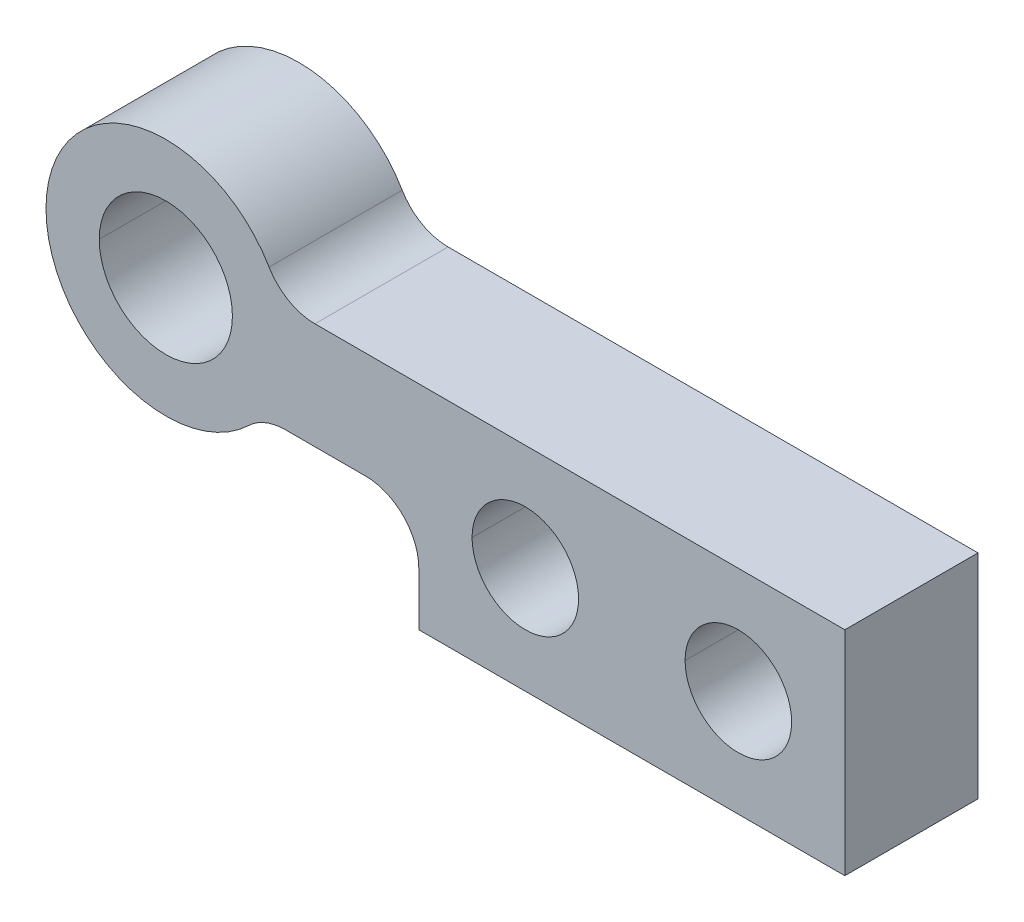
ISO-10303-21;
HEADER;
FILE_DESCRIPTION(('STEP AP214'),'2;1');
FILE_NAME('part.step','',(''),(''),'','','');
FILE_SCHEMA(('AUTOMOTIVE_DESIGN { 1 0 10303 214 1 1 1 1 }'));
ENDSEC;
DATA;
#1=APPLICATION_CONTEXT('core data for automotive mechanical design processes');
#2=APPLICATION_PROTOCOL_DEFINITION('international standard','automotive_design',2000,#1);
#3=PRODUCT_CONTEXT('',#1,'mechanical');
#4=PRODUCT('Part','Part','',(#3));
#5=PRODUCT_RELATED_PRODUCT_CATEGORY('part','',(#4));
#6=PRODUCT_DEFINITION_FORMATION('','',#4);
#7=PRODUCT_DEFINITION_CONTEXT('part definition',#1,'design');
#8=PRODUCT_DEFINITION('design','',#6,#7);
#9=PRODUCT_DEFINITION_SHAPE('','',#8);
#10=(LENGTH_UNIT() NAMED_UNIT(*) SI_UNIT(.MILLI.,.METRE.));
#11=(NAMED_UNIT(*) PLANE_ANGLE_UNIT() SI_UNIT($,.RADIAN.));
#12=(NAMED_UNIT(*) SI_UNIT($,.STERADIAN.) SOLID_ANGLE_UNIT());
#13=UNCERTAINTY_MEASURE_WITH_UNIT(LENGTH_MEASURE(1.E-05),#10,'distance_accuracy_value','');
#14=(GEOMETRIC_REPRESENTATION_CONTEXT(3) GLOBAL_UNCERTAINTY_ASSIGNED_CONTEXT((#13)) GLOBAL_UNIT_ASSIGNED_CONTEXT((#10,
#11,#12)) REPRESENTATION_CONTEXT('',''));
#15=CARTESIAN_POINT('',(0.,0.,0.));
#16=DIRECTION('',(0.,0.,1.));
#17=DIRECTION('',(1.,0.,0.));
#18=AXIS2_PLACEMENT_3D('',#15,#16,#17);
#19=CARTESIAN_POINT('',(-10.,-2.,5.));
#20=DIRECTION('',(0.,0.,-1.));
#21=DIRECTION('',(-1.,0.,0.));
#22=AXIS2_PLACEMENT_3D('',#19,#20,#21);
#23=CYLINDRICAL_SURFACE('',#22,2.);
#24=CARTESIAN_POINT('',(-10.,-2.,5.));
#25=DIRECTION('',(0.,0.,-1.));
#26=DIRECTION('',(1.,0.,0.));
#27=AXIS2_PLACEMENT_3D('',#24,#25,#26);
#28=CIRCLE('',#27,2.);
#29=CARTESIAN_POINT('',(-10.,0.,5.));
#30=VERTEX_POINT('',#29);
#31=CARTESIAN_POINT('',(-8.,-2.,5.));
#32=VERTEX_POINT('',#31);
#33=EDGE_CURVE('E281',#30,#32,#28,.T.);
#34=ORIENTED_EDGE('',*,*,#33,.F.);
#35=DIRECTION('',(0.,0.,1.));
#36=VECTOR('',#35,1.);
#37=CARTESIAN_POINT('',(-10.,0.,5.));
#38=LINE('',#37,#36);
#39=CARTESIAN_POINT('',(-10.,0.,0.));
#40=VERTEX_POINT('',#39);
#41=EDGE_CURVE('E241',#40,#30,#38,.T.);
#42=ORIENTED_EDGE('',*,*,#41,.F.);
#43=CARTESIAN_POINT('',(-10.,-2.,0.));
#44=DIRECTION('',(0.,0.,1.));
#45=DIRECTION('',(1.,0.,0.));
#46=AXIS2_PLACEMENT_3D('',#43,#44,#45);
#47=CIRCLE('',#46,2.);
#48=CARTESIAN_POINT('',(-8.,-2.,0.));
#49=VERTEX_POINT('',#48);
#50=EDGE_CURVE('E27',#49,#40,#47,.T.);
#51=ORIENTED_EDGE('',*,*,#50,.F.);
#52=DIRECTION('',(0.,0.,-1.));
#53=VECTOR('',#52,1.);
#54=CARTESIAN_POINT('',(-8.,-2.,5.));
#55=LINE('',#54,#53);
#56=EDGE_CURVE('E189',#32,#49,#55,.T.);
#57=ORIENTED_EDGE('',*,*,#56,.F.);
#58=EDGE_LOOP('',(#34,#42,#51,#57));
#59=FACE_BOUND('',#58,.T.);
#60=ADVANCED_FACE('F16',(#59),#23,.F.);
#61=CARTESIAN_POINT('',(-13.0100111358713,-2.,5.));
#62=DIRECTION('',(0.,0.,-1.));
#63=DIRECTION('',(-1.,0.,0.));
#64=AXIS2_PLACEMENT_3D('',#61,#62,#63);
#65=CYLINDRICAL_SURFACE('',#64,2.);
#66=CARTESIAN_POINT('',(-13.0100111358713,-2.,5.));
#67=DIRECTION('',(0.,0.,-1.));
#68=DIRECTION('',(1.,0.,0.));
#69=AXIS2_PLACEMENT_3D('',#66,#67,#68);
#70=CIRCLE('',#69,2.);
#71=CARTESIAN_POINT('',(-14.3915461709878,-0.553846153846153,5.));
#72=VERTEX_POINT('',#71);
#73=CARTESIAN_POINT('',(-13.0100111358713,0.,5.));
#74=VERTEX_POINT('',#73);
#75=EDGE_CURVE('E197',#72,#74,#70,.T.);
#76=ORIENTED_EDGE('',*,*,#75,.F.);
#77=DIRECTION('',(0.,0.,1.));
#78=VECTOR('',#77,1.);
#79=CARTESIAN_POINT('',(-14.3915461709878,-0.553846153846153,5.));
#80=LINE('',#79,#78);
#81=CARTESIAN_POINT('',(-14.3915461709878,-0.553846153846153,0.));
#82=VERTEX_POINT('',#81);
#83=EDGE_CURVE('E157',#82,#72,#80,.T.);
#84=ORIENTED_EDGE('',*,*,#83,.F.);
#85=CARTESIAN_POINT('',(-13.0100111358713,-2.,0.));
#86=DIRECTION('',(0.,0.,1.));
#87=DIRECTION('',(1.,0.,0.));
#88=AXIS2_PLACEMENT_3D('',#85,#86,#87);
#89=CIRCLE('',#88,2.);
#90=CARTESIAN_POINT('',(-13.0100111358713,0.,0.));
#91=VERTEX_POINT('',#90);
#92=EDGE_CURVE('E11',#91,#82,#89,.T.);
#93=ORIENTED_EDGE('',*,*,#92,.F.);
#94=DIRECTION('',(0.,0.,-1.));
#95=VECTOR('',#94,1.);
#96=CARTESIAN_POINT('',(-13.0100111358713,0.,5.));
#97=LINE('',#96,#95);
#98=EDGE_CURVE('E233',#74,#91,#97,.T.);
#99=ORIENTED_EDGE('',*,*,#98,.F.);
#100=EDGE_LOOP('',(#76,#84,#93,#99));
#101=FACE_BOUND('',#100,.T.);
#102=ADVANCED_FACE('F347',(#101),#65,.F.);
#103=CARTESIAN_POINT('',(-11.9,6.,5.));
#104=DIRECTION('',(0.,0.,-1.));
#105=DIRECTION('',(-1.,0.,0.));
#106=AXIS2_PLACEMENT_3D('',#103,#104,#105);
#107=CYLINDRICAL_SURFACE('',#106,2.);
#108=CARTESIAN_POINT('',(-11.9,6.,5.));
#109=DIRECTION('',(0.,0.,-1.));
#110=DIRECTION('',(1.,0.,0.));
#111=AXIS2_PLACEMENT_3D('',#108,#109,#110);
#112=CIRCLE('',#111,2.);
#113=CARTESIAN_POINT('',(-11.9,4.,5.));
#114=VERTEX_POINT('',#113);
#115=CARTESIAN_POINT('',(-13.6230769230769,4.98461538461538,5.));
#116=VERTEX_POINT('',#115);
#117=EDGE_CURVE('E194',#114,#116,#112,.T.);
#118=ORIENTED_EDGE('',*,*,#117,.F.);
#119=DIRECTION('',(0.,0.,1.));
#120=VECTOR('',#119,1.);
#121=CARTESIAN_POINT('',(-11.9,4.,5.));
#122=LINE('',#121,#120);
#123=CARTESIAN_POINT('',(-11.9,4.,0.));
#124=VERTEX_POINT('',#123);
#125=EDGE_CURVE('E210',#124,#114,#122,.T.);
#126=ORIENTED_EDGE('',*,*,#125,.F.);
#127=CARTESIAN_POINT('',(-11.9,6.,0.));
#128=DIRECTION('',(0.,0.,1.));
#129=DIRECTION('',(1.,0.,0.));
#130=AXIS2_PLACEMENT_3D('',#127,#128,#129);
#131=CIRCLE('',#130,2.);
#132=CARTESIAN_POINT('',(-13.6230769230769,4.98461538461538,0.));
#133=VERTEX_POINT('',#132);
#134=EDGE_CURVE('E267',#133,#124,#131,.T.);
#135=ORIENTED_EDGE('',*,*,#134,.F.);
#136=DIRECTION('',(0.,0.,-1.));
#137=VECTOR('',#136,1.);
#138=CARTESIAN_POINT('',(-13.6230769230769,4.98461538461538,5.));
#139=LINE('',#138,#137);
#140=EDGE_CURVE('E145',#116,#133,#139,.T.);
#141=ORIENTED_EDGE('',*,*,#140,.F.);
#142=EDGE_LOOP('',(#118,#126,#135,#141));
#143=FACE_BOUND('',#142,.T.);
#144=ADVANCED_FACE('F353',(#143),#107,.F.);
#145=CARTESIAN_POINT('',(0.,0.,0.));
#146=DIRECTION('',(0.,0.,1.));
#147=DIRECTION('',(1.,0.,0.));
#148=AXIS2_PLACEMENT_3D('',#145,#146,#147);
#149=PLANE('',#148);
#150=CARTESIAN_POINT('',(-17.5,2.7,0.));
#151=DIRECTION('',(0.,0.,1.));
#152=DIRECTION('',(1.,0.,0.));
#153=AXIS2_PLACEMENT_3D('',#150,#151,#152);
#154=CIRCLE('',#153,2.5);
#155=CARTESIAN_POINT('',(-20.,2.7,0.));
#156=VERTEX_POINT('',#155);
#157=CARTESIAN_POINT('',(-15.,2.7,0.));
#158=VERTEX_POINT('',#157);
#159=EDGE_CURVE('E250',#156,#158,#154,.T.);
#160=ORIENTED_EDGE('',*,*,#159,.T.);
#161=CARTESIAN_POINT('',(-17.5,2.7,0.));
#162=DIRECTION('',(0.,0.,1.));
#163=DIRECTION('',(1.,0.,0.));
#164=AXIS2_PLACEMENT_3D('',#161,#162,#163);
#165=CIRCLE('',#164,2.5);
#166=EDGE_CURVE('E20',#158,#156,#165,.T.);
#167=ORIENTED_EDGE('',*,*,#166,.T.);
#168=EDGE_LOOP('',(#160,#167));
#169=FACE_BOUND('',#168,.T.);
#170=CARTESIAN_POINT('',(-4.,0.,0.));
#171=DIRECTION('',(0.,0.,1.));
#172=DIRECTION('',(1.,0.,0.));
#173=AXIS2_PLACEMENT_3D('',#170,#171,#172);
#174=CIRCLE('',#173,2.);
#175=CARTESIAN_POINT('',(-6.,0.,0.));
#176=VERTEX_POINT('',#175);
#177=CARTESIAN_POINT('',(-2.,0.,0.));
#178=VERTEX_POINT('',#177);
#179=EDGE_CURVE('E190',#176,#178,#174,.T.);
#180=ORIENTED_EDGE('',*,*,#179,.T.);
#181=CARTESIAN_POINT('',(-4.,0.,0.));
#182=DIRECTION('',(0.,0.,1.));
#183=DIRECTION('',(1.,0.,0.));
#184=AXIS2_PLACEMENT_3D('',#181,#182,#183);
#185=CIRCLE('',#184,2.);
#186=EDGE_CURVE('E228',#178,#176,#185,.T.);
#187=ORIENTED_EDGE('',*,*,#186,.T.);
#188=EDGE_LOOP('',(#180,#187));
#189=FACE_BOUND('',#188,.T.);
#190=CARTESIAN_POINT('',(4.,0.,0.));
#191=DIRECTION('',(0.,0.,1.));
#192=DIRECTION('',(1.,0.,0.));
#193=AXIS2_PLACEMENT_3D('',#190,#191,#192);
#194=CIRCLE('',#193,2.);
#195=CARTESIAN_POINT('',(2.,0.,0.));
#196=VERTEX_POINT('',#195);
#197=CARTESIAN_POINT('',(6.,0.,0.));
#198=VERTEX_POINT('',#197);
#199=EDGE_CURVE('E171',#196,#198,#194,.T.);
#200=ORIENTED_EDGE('',*,*,#199,.T.);
#201=CARTESIAN_POINT('',(4.,0.,0.));
#202=DIRECTION('',(0.,0.,1.));
#203=DIRECTION('',(1.,0.,0.));
#204=AXIS2_PLACEMENT_3D('',#201,#202,#203);
#205=CIRCLE('',#204,2.);
#206=EDGE_CURVE('E242',#198,#196,#205,.T.);
#207=ORIENTED_EDGE('',*,*,#206,.T.);
#208=EDGE_LOOP('',(#200,#207));
#209=FACE_BOUND('',#208,.T.);
#210=CARTESIAN_POINT('',(-17.5,2.7,0.));
#211=DIRECTION('',(0.,0.,1.));
#212=DIRECTION('',(1.,0.,0.));
#213=AXIS2_PLACEMENT_3D('',#210,#211,#212);
#214=CIRCLE('',#213,4.5);
#215=CARTESIAN_POINT('',(-22.,2.7,0.));
#216=VERTEX_POINT('',#215);
#217=EDGE_CURVE('E138',#133,#216,#214,.T.);
#218=ORIENTED_EDGE('',*,*,#217,.F.);
#219=ORIENTED_EDGE('',*,*,#134,.T.);
#220=DIRECTION('',(1.,0.,0.));
#221=VECTOR('',#220,1.);
#222=CARTESIAN_POINT('',(0.,4.,0.));
#223=LINE('',#222,#221);
#224=CARTESIAN_POINT('',(8.,4.,0.));
#225=VERTEX_POINT('',#224);
#226=EDGE_CURVE('E206',#124,#225,#223,.T.);
#227=ORIENTED_EDGE('',*,*,#226,.T.);
#228=DIRECTION('',(0.,-1.,0.));
#229=VECTOR('',#228,1.);
#230=CARTESIAN_POINT('',(8.,0.,0.));
#231=LINE('',#230,#229);
#232=CARTESIAN_POINT('',(8.,-4.,0.));
#233=VERTEX_POINT('',#232);
#234=EDGE_CURVE('E201',#225,#233,#231,.T.);
#235=ORIENTED_EDGE('',*,*,#234,.T.);
#236=DIRECTION('',(1.,0.,0.));
#237=VECTOR('',#236,1.);
#238=CARTESIAN_POINT('',(0.,-4.,0.));
#239=LINE('',#238,#237);
#240=CARTESIAN_POINT('',(-8.,-4.,0.));
#241=VERTEX_POINT('',#240);
#242=EDGE_CURVE('E221',#241,#233,#239,.T.);
#243=ORIENTED_EDGE('',*,*,#242,.F.);
#244=DIRECTION('',(0.,-1.,0.));
#245=VECTOR('',#244,1.);
#246=CARTESIAN_POINT('',(-8.,0.,0.));
#247=LINE('',#246,#245);
#248=EDGE_CURVE('E184',#49,#241,#247,.T.);
#249=ORIENTED_EDGE('',*,*,#248,.F.);
#250=ORIENTED_EDGE('',*,*,#50,.T.);
#251=DIRECTION('',(-1.,0.,0.));
#252=VECTOR('',#251,1.);
#253=CARTESIAN_POINT('',(0.,0.,0.));
#254=LINE('',#253,#252);
#255=EDGE_CURVE('E261',#40,#91,#254,.T.);
#256=ORIENTED_EDGE('',*,*,#255,.T.);
#257=ORIENTED_EDGE('',*,*,#92,.T.);
#258=CARTESIAN_POINT('',(-17.5,2.7,0.));
#259=DIRECTION('',(0.,0.,1.));
#260=DIRECTION('',(1.,0.,0.));
#261=AXIS2_PLACEMENT_3D('',#258,#259,#260);
#262=CIRCLE('',#261,4.5);
#263=EDGE_CURVE('E150',#216,#82,#262,.T.);
#264=ORIENTED_EDGE('',*,*,#263,.F.);
#265=EDGE_LOOP('',(#218,#219,#227,#235,#243,#249,#250,#256,#257,#264));
#266=FACE_BOUND('',#265,.T.);
#267=ADVANCED_FACE('F151',(#169,#189,#209,#266),#149,.F.);
#268=CARTESIAN_POINT('',(0.,0.,5.));
#269=DIRECTION('',(0.,0.,1.));
#270=DIRECTION('',(1.,0.,0.));
#271=AXIS2_PLACEMENT_3D('',#268,#269,#270);
#272=PLANE('',#271);
#273=CARTESIAN_POINT('',(-17.5,2.7,5.));
#274=DIRECTION('',(0.,0.,1.));
#275=DIRECTION('',(1.,0.,0.));
#276=AXIS2_PLACEMENT_3D('',#273,#274,#275);
#277=CIRCLE('',#276,2.5);
#278=CARTESIAN_POINT('',(-20.,2.7,5.));
#279=VERTEX_POINT('',#278);
#280=CARTESIAN_POINT('',(-15.,2.7,5.));
#281=VERTEX_POINT('',#280);
#282=EDGE_CURVE('E268',#279,#281,#277,.T.);
#283=ORIENTED_EDGE('',*,*,#282,.F.);
#284=CARTESIAN_POINT('',(-17.5,2.7,5.));
#285=DIRECTION('',(0.,0.,1.));
#286=DIRECTION('',(1.,0.,0.));
#287=AXIS2_PLACEMENT_3D('',#284,#285,#286);
#288=CIRCLE('',#287,2.5);
#289=EDGE_CURVE('E200',#281,#279,#288,.T.);
#290=ORIENTED_EDGE('',*,*,#289,.F.);
#291=EDGE_LOOP('',(#283,#290));
#292=FACE_BOUND('',#291,.T.);
#293=CARTESIAN_POINT('',(-4.,0.,5.));
#294=DIRECTION('',(0.,0.,1.));
#295=DIRECTION('',(1.,0.,0.));
#296=AXIS2_PLACEMENT_3D('',#293,#294,#295);
#297=CIRCLE('',#296,2.);
#298=CARTESIAN_POINT('',(-6.,0.,5.));
#299=VERTEX_POINT('',#298);
#300=CARTESIAN_POINT('',(-2.,0.,5.));
#301=VERTEX_POINT('',#300);
#302=EDGE_CURVE('E179',#299,#301,#297,.T.);
#303=ORIENTED_EDGE('',*,*,#302,.F.);
#304=CARTESIAN_POINT('',(-4.,0.,5.));
#305=DIRECTION('',(0.,0.,1.));
#306=DIRECTION('',(1.,0.,0.));
#307=AXIS2_PLACEMENT_3D('',#304,#305,#306);
#308=CIRCLE('',#307,2.);
#309=EDGE_CURVE('E224',#301,#299,#308,.T.);
#310=ORIENTED_EDGE('',*,*,#309,.F.);
#311=EDGE_LOOP('',(#303,#310));
#312=FACE_BOUND('',#311,.T.);
#313=CARTESIAN_POINT('',(4.,0.,5.));
#314=DIRECTION('',(0.,0.,1.));
#315=DIRECTION('',(1.,0.,0.));
#316=AXIS2_PLACEMENT_3D('',#313,#314,#315);
#317=CIRCLE('',#316,2.);
#318=CARTESIAN_POINT('',(2.,0.,5.));
#319=VERTEX_POINT('',#318);
#320=CARTESIAN_POINT('',(6.,0.,5.));
#321=VERTEX_POINT('',#320);
#322=EDGE_CURVE('E205',#319,#321,#317,.T.);
#323=ORIENTED_EDGE('',*,*,#322,.F.);
#324=CARTESIAN_POINT('',(4.,0.,5.));
#325=DIRECTION('',(0.,0.,1.));
#326=DIRECTION('',(1.,0.,0.));
#327=AXIS2_PLACEMENT_3D('',#324,#325,#326);
#328=CIRCLE('',#327,2.);
#329=EDGE_CURVE('E246',#321,#319,#328,.T.);
#330=ORIENTED_EDGE('',*,*,#329,.F.);
#331=EDGE_LOOP('',(#323,#330));
#332=FACE_BOUND('',#331,.T.);
#333=DIRECTION('',(1.,0.,0.));
#334=VECTOR('',#333,1.);
#335=CARTESIAN_POINT('',(0.,4.,5.));
#336=LINE('',#335,#334);
#337=CARTESIAN_POINT('',(8.,4.,5.));
#338=VERTEX_POINT('',#337);
#339=EDGE_CURVE('E254',#114,#338,#336,.T.);
#340=ORIENTED_EDGE('',*,*,#339,.F.);
#341=ORIENTED_EDGE('',*,*,#117,.T.);
#342=CARTESIAN_POINT('',(-17.5,2.7,5.));
#343=DIRECTION('',(0.,0.,1.));
#344=DIRECTION('',(1.,0.,0.));
#345=AXIS2_PLACEMENT_3D('',#342,#343,#344);
#346=CIRCLE('',#345,4.5);
#347=CARTESIAN_POINT('',(-22.,2.7,5.));
#348=VERTEX_POINT('',#347);
#349=EDGE_CURVE('E257',#116,#348,#346,.T.);
#350=ORIENTED_EDGE('',*,*,#349,.T.);
#351=CARTESIAN_POINT('',(-17.5,2.7,5.));
#352=DIRECTION('',(0.,0.,1.));
#353=DIRECTION('',(1.,0.,0.));
#354=AXIS2_PLACEMENT_3D('',#351,#352,#353);
#355=CIRCLE('',#354,4.5);
#356=EDGE_CURVE('E161',#348,#72,#355,.T.);
#357=ORIENTED_EDGE('',*,*,#356,.T.);
#358=ORIENTED_EDGE('',*,*,#75,.T.);
#359=DIRECTION('',(-1.,0.,0.));
#360=VECTOR('',#359,1.);
#361=CARTESIAN_POINT('',(0.,0.,5.));
#362=LINE('',#361,#360);
#363=EDGE_CURVE('E148',#30,#74,#362,.T.);
#364=ORIENTED_EDGE('',*,*,#363,.F.);
#365=ORIENTED_EDGE('',*,*,#33,.T.);
#366=DIRECTION('',(0.,-1.,0.));
#367=VECTOR('',#366,1.);
#368=CARTESIAN_POINT('',(-8.,0.,5.));
#369=LINE('',#368,#367);
#370=CARTESIAN_POINT('',(-8.,-4.,5.));
#371=VERTEX_POINT('',#370);
#372=EDGE_CURVE('E237',#32,#371,#369,.T.);
#373=ORIENTED_EDGE('',*,*,#372,.T.);
#374=DIRECTION('',(1.,0.,0.));
#375=VECTOR('',#374,1.);
#376=CARTESIAN_POINT('',(0.,-4.,5.));
#377=LINE('',#376,#375);
#378=CARTESIAN_POINT('',(8.,-4.,5.));
#379=VERTEX_POINT('',#378);
#380=EDGE_CURVE('E229',#371,#379,#377,.T.);
#381=ORIENTED_EDGE('',*,*,#380,.T.);
#382=DIRECTION('',(0.,-1.,0.));
#383=VECTOR('',#382,1.);
#384=CARTESIAN_POINT('',(8.,0.,5.));
#385=LINE('',#384,#383);
#386=EDGE_CURVE('E42',#338,#379,#385,.T.);
#387=ORIENTED_EDGE('',*,*,#386,.F.);
#388=EDGE_LOOP('',(#340,#341,#350,#357,#358,#364,#365,#373,#381,#387));
#389=FACE_BOUND('',#388,.T.);
#390=ADVANCED_FACE('F341',(#292,#312,#332,#389),#272,.T.);
#391=CARTESIAN_POINT('',(-17.5,2.7,5.));
#392=DIRECTION('',(0.,0.,-1.));
#393=DIRECTION('',(-1.,0.,0.));
#394=AXIS2_PLACEMENT_3D('',#391,#392,#393);
#395=CYLINDRICAL_SURFACE('',#394,2.5);
#396=DIRECTION('',(0.,0.,-1.));
#397=VECTOR('',#396,1.);
#398=CARTESIAN_POINT('',(-15.,2.7,5.));
#399=LINE('',#398,#397);
#400=EDGE_CURVE('E271',#281,#158,#399,.T.);
#401=ORIENTED_EDGE('',*,*,#400,.F.);
#402=ORIENTED_EDGE('',*,*,#289,.T.);
#403=DIRECTION('',(0.,0.,-1.));
#404=VECTOR('',#403,1.);
#405=CARTESIAN_POINT('',(-20.,2.7,5.));
#406=LINE('',#405,#404);
#407=EDGE_CURVE('E217',#279,#156,#406,.T.);
#408=ORIENTED_EDGE('',*,*,#407,.T.);
#409=ORIENTED_EDGE('',*,*,#166,.F.);
#410=EDGE_LOOP('',(#401,#402,#408,#409));
#411=FACE_BOUND('',#410,.T.);
#412=ADVANCED_FACE('F331',(#411),#395,.F.);
#413=CARTESIAN_POINT('',(8.,0.,5.));
#414=DIRECTION('',(1.,0.,0.));
#415=DIRECTION('',(0.,1.,0.));
#416=AXIS2_PLACEMENT_3D('',#413,#414,#415);
#417=PLANE('',#416);
#418=ORIENTED_EDGE('',*,*,#234,.F.);
#419=DIRECTION('',(0.,0.,-1.));
#420=VECTOR('',#419,1.);
#421=CARTESIAN_POINT('',(8.,4.,5.));
#422=LINE('',#421,#420);
#423=EDGE_CURVE('E284',#338,#225,#422,.T.);
#424=ORIENTED_EDGE('',*,*,#423,.F.);
#425=ORIENTED_EDGE('',*,*,#386,.T.);
#426=DIRECTION('',(0.,0.,-1.));
#427=VECTOR('',#426,1.);
#428=CARTESIAN_POINT('',(8.,-4.,5.));
#429=LINE('',#428,#427);
#430=EDGE_CURVE('E236',#379,#233,#429,.T.);
#431=ORIENTED_EDGE('',*,*,#430,.T.);
#432=EDGE_LOOP('',(#418,#424,#425,#431));
#433=FACE_BOUND('',#432,.T.);
#434=ADVANCED_FACE('F328',(#433),#417,.T.);
#435=CARTESIAN_POINT('',(4.,0.,5.));
#436=DIRECTION('',(0.,0.,-1.));
#437=DIRECTION('',(-1.,0.,0.));
#438=AXIS2_PLACEMENT_3D('',#435,#436,#437);
#439=CYLINDRICAL_SURFACE('',#438,2.);
#440=DIRECTION('',(0.,0.,-1.));
#441=VECTOR('',#440,1.);
#442=CARTESIAN_POINT('',(6.,0.,5.));
#443=LINE('',#442,#441);
#444=EDGE_CURVE('E175',#321,#198,#443,.T.);
#445=ORIENTED_EDGE('',*,*,#444,.F.);
#446=ORIENTED_EDGE('',*,*,#329,.T.);
#447=DIRECTION('',(0.,0.,-1.));
#448=VECTOR('',#447,1.);
#449=CARTESIAN_POINT('',(2.,0.,5.));
#450=LINE('',#449,#448);
#451=EDGE_CURVE('E174',#319,#196,#450,.T.);
#452=ORIENTED_EDGE('',*,*,#451,.T.);
#453=ORIENTED_EDGE('',*,*,#206,.F.);
#454=EDGE_LOOP('',(#445,#446,#452,#453));
#455=FACE_BOUND('',#454,.T.);
#456=ADVANCED_FACE('F330',(#455),#439,.F.);
#457=CARTESIAN_POINT('',(-4.,0.,5.));
#458=DIRECTION('',(0.,0.,-1.));
#459=DIRECTION('',(-1.,0.,0.));
#460=AXIS2_PLACEMENT_3D('',#457,#458,#459);
#461=CYLINDRICAL_SURFACE('',#460,2.);
#462=DIRECTION('',(0.,0.,-1.));
#463=VECTOR('',#462,1.);
#464=CARTESIAN_POINT('',(-2.,0.,5.));
#465=LINE('',#464,#463);
#466=EDGE_CURVE('E183',#301,#178,#465,.T.);
#467=ORIENTED_EDGE('',*,*,#466,.F.);
#468=ORIENTED_EDGE('',*,*,#309,.T.);
#469=DIRECTION('',(0.,0.,-1.));
#470=VECTOR('',#469,1.);
#471=CARTESIAN_POINT('',(-6.,0.,5.));
#472=LINE('',#471,#470);
#473=EDGE_CURVE('E168',#299,#176,#472,.T.);
#474=ORIENTED_EDGE('',*,*,#473,.T.);
#475=ORIENTED_EDGE('',*,*,#186,.F.);
#476=EDGE_LOOP('',(#467,#468,#474,#475));
#477=FACE_BOUND('',#476,.T.);
#478=ADVANCED_FACE('F338',(#477),#461,.F.);
#479=CARTESIAN_POINT('',(0.,-4.,5.));
#480=DIRECTION('',(0.,1.,0.));
#481=DIRECTION('',(1.,0.,0.));
#482=AXIS2_PLACEMENT_3D('',#479,#480,#481);
#483=PLANE('',#482);
#484=ORIENTED_EDGE('',*,*,#242,.T.);
#485=ORIENTED_EDGE('',*,*,#430,.F.);
#486=ORIENTED_EDGE('',*,*,#380,.F.);
#487=DIRECTION('',(0.,0.,-1.));
#488=VECTOR('',#487,1.);
#489=CARTESIAN_POINT('',(-8.,-4.,5.));
#490=LINE('',#489,#488);
#491=EDGE_CURVE('E188',#371,#241,#490,.T.);
#492=ORIENTED_EDGE('',*,*,#491,.T.);
#493=EDGE_LOOP('',(#484,#485,#486,#492));
#494=FACE_BOUND('',#493,.T.);
#495=ADVANCED_FACE('F322',(#494),#483,.F.);
#496=CARTESIAN_POINT('',(-8.,0.,5.));
#497=DIRECTION('',(1.,0.,0.));
#498=DIRECTION('',(0.,1.,0.));
#499=AXIS2_PLACEMENT_3D('',#496,#497,#498);
#500=PLANE('',#499);
#501=ORIENTED_EDGE('',*,*,#372,.F.);
#502=ORIENTED_EDGE('',*,*,#56,.T.);
#503=ORIENTED_EDGE('',*,*,#248,.T.);
#504=ORIENTED_EDGE('',*,*,#491,.F.);
#505=EDGE_LOOP('',(#501,#502,#503,#504));
#506=FACE_BOUND('',#505,.T.);
#507=ADVANCED_FACE('F363',(#506),#500,.F.);
#508=CARTESIAN_POINT('',(0.,0.,5.));
#509=DIRECTION('',(0.,-1.,0.));
#510=DIRECTION('',(-1.,0.,0.));
#511=AXIS2_PLACEMENT_3D('',#508,#509,#510);
#512=PLANE('',#511);
#513=ORIENTED_EDGE('',*,*,#363,.T.);
#514=ORIENTED_EDGE('',*,*,#98,.T.);
#515=ORIENTED_EDGE('',*,*,#255,.F.);
#516=ORIENTED_EDGE('',*,*,#41,.T.);
#517=EDGE_LOOP('',(#513,#514,#515,#516));
#518=FACE_BOUND('',#517,.T.);
#519=ADVANCED_FACE('F360',(#518),#512,.T.);
#520=CARTESIAN_POINT('',(-17.5,2.7,5.));
#521=DIRECTION('',(0.,0.,-1.));
#522=DIRECTION('',(-1.,0.,0.));
#523=AXIS2_PLACEMENT_3D('',#520,#521,#522);
#524=CYLINDRICAL_SURFACE('',#523,4.5);
#525=DIRECTION('',(0.,0.,-1.));
#526=VECTOR('',#525,1.);
#527=CARTESIAN_POINT('',(-22.,2.7,5.));
#528=LINE('',#527,#526);
#529=EDGE_CURVE('E142',#348,#216,#528,.T.);
#530=ORIENTED_EDGE('',*,*,#529,.F.);
#531=ORIENTED_EDGE('',*,*,#349,.F.);
#532=ORIENTED_EDGE('',*,*,#140,.T.);
#533=ORIENTED_EDGE('',*,*,#217,.T.);
#534=EDGE_LOOP('',(#530,#531,#532,#533));
#535=FACE_BOUND('',#534,.T.);
#536=ADVANCED_FACE('F18',(#535),#524,.T.);
#537=CARTESIAN_POINT('',(0.,4.,5.));
#538=DIRECTION('',(0.,1.,0.));
#539=DIRECTION('',(1.,0.,0.));
#540=AXIS2_PLACEMENT_3D('',#537,#538,#539);
#541=PLANE('',#540);
#542=ORIENTED_EDGE('',*,*,#226,.F.);
#543=ORIENTED_EDGE('',*,*,#125,.T.);
#544=ORIENTED_EDGE('',*,*,#339,.T.);
#545=ORIENTED_EDGE('',*,*,#423,.T.);
#546=EDGE_LOOP('',(#542,#543,#544,#545));
#547=FACE_BOUND('',#546,.T.);
#548=ADVANCED_FACE('F413',(#547),#541,.T.);
#549=CARTESIAN_POINT('',(-17.5,2.7,5.));
#550=DIRECTION('',(0.,0.,-1.));
#551=DIRECTION('',(-1.,0.,0.));
#552=AXIS2_PLACEMENT_3D('',#549,#550,#551);
#553=CYLINDRICAL_SURFACE('',#552,4.5);
#554=ORIENTED_EDGE('',*,*,#356,.F.);
#555=ORIENTED_EDGE('',*,*,#529,.T.);
#556=ORIENTED_EDGE('',*,*,#263,.T.);
#557=ORIENTED_EDGE('',*,*,#83,.T.);
#558=EDGE_LOOP('',(#554,#555,#556,#557));
#559=FACE_BOUND('',#558,.T.);
#560=ADVANCED_FACE('F159',(#559),#553,.T.);
#561=CARTESIAN_POINT('',(-4.,0.,5.));
#562=DIRECTION('',(0.,0.,-1.));
#563=DIRECTION('',(-1.,0.,0.));
#564=AXIS2_PLACEMENT_3D('',#561,#562,#563);
#565=CYLINDRICAL_SURFACE('',#564,2.);
#566=ORIENTED_EDGE('',*,*,#302,.T.);
#567=ORIENTED_EDGE('',*,*,#466,.T.);
#568=ORIENTED_EDGE('',*,*,#179,.F.);
#569=ORIENTED_EDGE('',*,*,#473,.F.);
#570=EDGE_LOOP('',(#566,#567,#568,#569));
#571=FACE_BOUND('',#570,.T.);
#572=ADVANCED_FACE('F358',(#571),#565,.F.);
#573=CARTESIAN_POINT('',(4.,0.,5.));
#574=DIRECTION('',(0.,0.,-1.));
#575=DIRECTION('',(-1.,0.,0.));
#576=AXIS2_PLACEMENT_3D('',#573,#574,#575);
#577=CYLINDRICAL_SURFACE('',#576,2.);
#578=ORIENTED_EDGE('',*,*,#322,.T.);
#579=ORIENTED_EDGE('',*,*,#444,.T.);
#580=ORIENTED_EDGE('',*,*,#199,.F.);
#581=ORIENTED_EDGE('',*,*,#451,.F.);
#582=EDGE_LOOP('',(#578,#579,#580,#581));
#583=FACE_BOUND('',#582,.T.);
#584=ADVANCED_FACE('F511',(#583),#577,.F.);
#585=CARTESIAN_POINT('',(-17.5,2.7,5.));
#586=DIRECTION('',(0.,0.,-1.));
#587=DIRECTION('',(-1.,0.,0.));
#588=AXIS2_PLACEMENT_3D('',#585,#586,#587);
#589=CYLINDRICAL_SURFACE('',#588,2.5);
#590=ORIENTED_EDGE('',*,*,#282,.T.);
#591=ORIENTED_EDGE('',*,*,#400,.T.);
#592=ORIENTED_EDGE('',*,*,#159,.F.);
#593=ORIENTED_EDGE('',*,*,#407,.F.);
#594=EDGE_LOOP('',(#590,#591,#592,#593));
#595=FACE_BOUND('',#594,.T.);
#596=ADVANCED_FACE('F520',(#595),#589,.F.);
#597=CLOSED_SHELL('',(#60,#102,#144,#267,#390,#412,#434,#456,#478,#495,#507,#519,#536,#548,#560,
#572,#584,#596));
#598=MANIFOLD_SOLID_BREP('B1',#597);
#599=ADVANCED_BREP_SHAPE_REPRESENTATION('',(#18,#598),#14);
#600=SHAPE_DEFINITION_REPRESENTATION(#9,#599);
ENDSEC;
END-ISO-10303-21;
